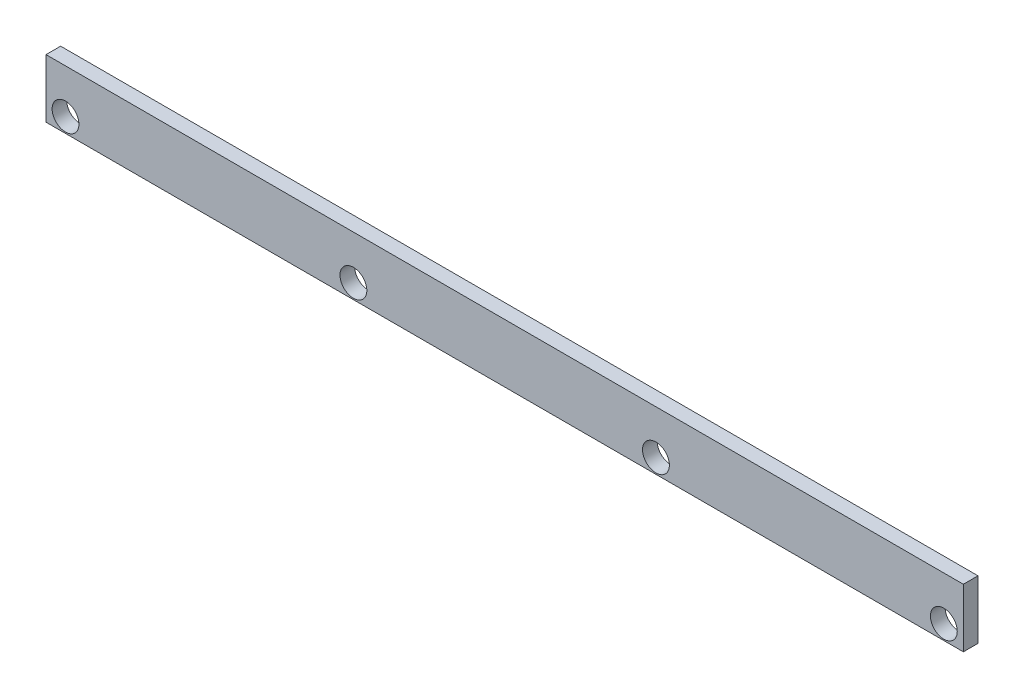
ISO-10303-21;
HEADER;
FILE_DESCRIPTION(('STEP AP214'),'2;1');
FILE_NAME('part.step','',(''),(''),'','','');
FILE_SCHEMA(('AUTOMOTIVE_DESIGN { 1 0 10303 214 1 1 1 1 }'));
ENDSEC;
DATA;
#1=APPLICATION_CONTEXT('core data for automotive mechanical design processes');
#2=APPLICATION_PROTOCOL_DEFINITION('international standard','automotive_design',2000,#1);
#3=PRODUCT_CONTEXT('',#1,'mechanical');
#4=PRODUCT('Part','Part','',(#3));
#5=PRODUCT_RELATED_PRODUCT_CATEGORY('part','',(#4));
#6=PRODUCT_DEFINITION_FORMATION('','',#4);
#7=PRODUCT_DEFINITION_CONTEXT('part definition',#1,'design');
#8=PRODUCT_DEFINITION('design','',#6,#7);
#9=PRODUCT_DEFINITION_SHAPE('','',#8);
#10=(LENGTH_UNIT() NAMED_UNIT(*) SI_UNIT(.MILLI.,.METRE.));
#11=(NAMED_UNIT(*) PLANE_ANGLE_UNIT() SI_UNIT($,.RADIAN.));
#12=(NAMED_UNIT(*) SI_UNIT($,.STERADIAN.) SOLID_ANGLE_UNIT());
#13=UNCERTAINTY_MEASURE_WITH_UNIT(LENGTH_MEASURE(1.E-05),#10,'distance_accuracy_value','');
#14=(GEOMETRIC_REPRESENTATION_CONTEXT(3) GLOBAL_UNCERTAINTY_ASSIGNED_CONTEXT((#13)) GLOBAL_UNIT_ASSIGNED_CONTEXT((#10,
#11,#12)) REPRESENTATION_CONTEXT('',''));
#15=CARTESIAN_POINT('',(0.,0.,0.));
#16=DIRECTION('',(0.,0.,1.));
#17=DIRECTION('',(1.,0.,0.));
#18=AXIS2_PLACEMENT_3D('',#15,#16,#17);
#19=CARTESIAN_POINT('',(0.,0.,3.));
#20=DIRECTION('',(0.,0.,1.));
#21=DIRECTION('',(1.,0.,0.));
#22=AXIS2_PLACEMENT_3D('',#19,#20,#21);
#23=PLANE('',#22);
#24=CARTESIAN_POINT('',(31.,-9.,3.));
#25=DIRECTION('',(0.,0.,1.));
#26=DIRECTION('',(1.,0.,0.));
#27=AXIS2_PLACEMENT_3D('',#24,#25,#26);
#28=CIRCLE('',#27,2.75);
#29=CARTESIAN_POINT('',(33.75,-9.,3.));
#30=VERTEX_POINT('',#29);
#31=EDGE_CURVE('E150',#30,#30,#28,.T.);
#32=ORIENTED_EDGE('',*,*,#31,.F.);
#33=EDGE_LOOP('',(#32));
#34=FACE_BOUND('',#33,.T.);
#35=CARTESIAN_POINT('',(-90.,-9.,3.));
#36=DIRECTION('',(0.,0.,1.));
#37=DIRECTION('',(1.,0.,0.));
#38=AXIS2_PLACEMENT_3D('',#35,#36,#37);
#39=CIRCLE('',#38,2.75);
#40=CARTESIAN_POINT('',(-87.25,-9.,3.));
#41=VERTEX_POINT('',#40);
#42=EDGE_CURVE('E120',#41,#41,#39,.T.);
#43=ORIENTED_EDGE('',*,*,#42,.F.);
#44=EDGE_LOOP('',(#43));
#45=FACE_BOUND('',#44,.T.);
#46=DIRECTION('',(0.,-1.,0.));
#47=VECTOR('',#46,1.);
#48=CARTESIAN_POINT('',(-94.,0.,3.));
#49=LINE('',#48,#47);
#50=CARTESIAN_POINT('',(-94.,0.,3.));
#51=VERTEX_POINT('',#50);
#52=CARTESIAN_POINT('',(-94.,-12.,3.));
#53=VERTEX_POINT('',#52);
#54=EDGE_CURVE('E98',#51,#53,#49,.T.);
#55=ORIENTED_EDGE('',*,*,#54,.T.);
#56=DIRECTION('',(1.,0.,0.));
#57=VECTOR('',#56,1.);
#58=CARTESIAN_POINT('',(-94.,-12.,3.));
#59=LINE('',#58,#57);
#60=CARTESIAN_POINT('',(94.,-12.,3.));
#61=VERTEX_POINT('',#60);
#62=EDGE_CURVE('E93',#53,#61,#59,.T.);
#63=ORIENTED_EDGE('',*,*,#62,.T.);
#64=DIRECTION('',(0.,1.,0.));
#65=VECTOR('',#64,1.);
#66=CARTESIAN_POINT('',(94.,-12.,3.));
#67=LINE('',#66,#65);
#68=CARTESIAN_POINT('',(94.,0.,3.));
#69=VERTEX_POINT('',#68);
#70=EDGE_CURVE('E96',#61,#69,#67,.T.);
#71=ORIENTED_EDGE('',*,*,#70,.T.);
#72=DIRECTION('',(-1.,0.,0.));
#73=VECTOR('',#72,1.);
#74=CARTESIAN_POINT('',(94.,0.,3.));
#75=LINE('',#74,#73);
#76=EDGE_CURVE('E63',#69,#51,#75,.T.);
#77=ORIENTED_EDGE('',*,*,#76,.T.);
#78=EDGE_LOOP('',(#55,#63,#71,#77));
#79=FACE_BOUND('',#78,.T.);
#80=CARTESIAN_POINT('',(-31.,-9.,3.));
#81=DIRECTION('',(0.,0.,1.));
#82=DIRECTION('',(1.,0.,0.));
#83=AXIS2_PLACEMENT_3D('',#80,#81,#82);
#84=CIRCLE('',#83,2.75);
#85=CARTESIAN_POINT('',(-28.25,-9.,3.));
#86=VERTEX_POINT('',#85);
#87=EDGE_CURVE('E143',#86,#86,#84,.T.);
#88=ORIENTED_EDGE('',*,*,#87,.F.);
#89=EDGE_LOOP('',(#88));
#90=FACE_BOUND('',#89,.T.);
#91=CARTESIAN_POINT('',(90.,-9.,3.));
#92=DIRECTION('',(0.,0.,1.));
#93=DIRECTION('',(1.,0.,0.));
#94=AXIS2_PLACEMENT_3D('',#91,#92,#93);
#95=CIRCLE('',#94,2.75);
#96=CARTESIAN_POINT('',(92.75,-9.,3.));
#97=VERTEX_POINT('',#96);
#98=EDGE_CURVE('E158',#97,#97,#95,.T.);
#99=ORIENTED_EDGE('',*,*,#98,.F.);
#100=EDGE_LOOP('',(#99));
#101=FACE_BOUND('',#100,.T.);
#102=ADVANCED_FACE('F45',(#34,#45,#79,#90,#101),#23,.T.);
#103=CARTESIAN_POINT('',(0.,0.,0.));
#104=DIRECTION('',(0.,0.,1.));
#105=DIRECTION('',(1.,0.,0.));
#106=AXIS2_PLACEMENT_3D('',#103,#104,#105);
#107=PLANE('',#106);
#108=DIRECTION('',(0.,-1.,0.));
#109=VECTOR('',#108,1.);
#110=CARTESIAN_POINT('',(-94.,0.,0.));
#111=LINE('',#110,#109);
#112=CARTESIAN_POINT('',(-94.,0.,0.));
#113=VERTEX_POINT('',#112);
#114=CARTESIAN_POINT('',(-94.,-12.,0.));
#115=VERTEX_POINT('',#114);
#116=EDGE_CURVE('E116',#113,#115,#111,.T.);
#117=ORIENTED_EDGE('',*,*,#116,.F.);
#118=DIRECTION('',(-1.,0.,0.));
#119=VECTOR('',#118,1.);
#120=CARTESIAN_POINT('',(94.,0.,0.));
#121=LINE('',#120,#119);
#122=CARTESIAN_POINT('',(94.,0.,0.));
#123=VERTEX_POINT('',#122);
#124=EDGE_CURVE('E86',#123,#113,#121,.T.);
#125=ORIENTED_EDGE('',*,*,#124,.F.);
#126=DIRECTION('',(0.,1.,0.));
#127=VECTOR('',#126,1.);
#128=CARTESIAN_POINT('',(94.,-12.,0.));
#129=LINE('',#128,#127);
#130=CARTESIAN_POINT('',(94.,-12.,0.));
#131=VERTEX_POINT('',#130);
#132=EDGE_CURVE('E80',#131,#123,#129,.T.);
#133=ORIENTED_EDGE('',*,*,#132,.F.);
#134=DIRECTION('',(1.,0.,0.));
#135=VECTOR('',#134,1.);
#136=CARTESIAN_POINT('',(-94.,-12.,0.));
#137=LINE('',#136,#135);
#138=EDGE_CURVE('E103',#115,#131,#137,.T.);
#139=ORIENTED_EDGE('',*,*,#138,.F.);
#140=EDGE_LOOP('',(#117,#125,#133,#139));
#141=FACE_BOUND('',#140,.T.);
#142=CARTESIAN_POINT('',(-90.,-9.,0.));
#143=DIRECTION('',(0.,0.,1.));
#144=DIRECTION('',(1.,0.,0.));
#145=AXIS2_PLACEMENT_3D('',#142,#143,#144);
#146=CIRCLE('',#145,2.75);
#147=CARTESIAN_POINT('',(-87.25,-9.,0.));
#148=VERTEX_POINT('',#147);
#149=EDGE_CURVE('E139',#148,#148,#146,.T.);
#150=ORIENTED_EDGE('',*,*,#149,.T.);
#151=EDGE_LOOP('',(#150));
#152=FACE_BOUND('',#151,.T.);
#153=CARTESIAN_POINT('',(-31.,-9.,0.));
#154=DIRECTION('',(0.,0.,1.));
#155=DIRECTION('',(1.,0.,0.));
#156=AXIS2_PLACEMENT_3D('',#153,#154,#155);
#157=CIRCLE('',#156,2.75);
#158=CARTESIAN_POINT('',(-28.25,-9.,0.));
#159=VERTEX_POINT('',#158);
#160=EDGE_CURVE('E146',#159,#159,#157,.T.);
#161=ORIENTED_EDGE('',*,*,#160,.T.);
#162=EDGE_LOOP('',(#161));
#163=FACE_BOUND('',#162,.T.);
#164=CARTESIAN_POINT('',(31.,-9.,0.));
#165=DIRECTION('',(0.,0.,1.));
#166=DIRECTION('',(1.,0.,0.));
#167=AXIS2_PLACEMENT_3D('',#164,#165,#166);
#168=CIRCLE('',#167,2.75);
#169=CARTESIAN_POINT('',(33.75,-9.,0.));
#170=VERTEX_POINT('',#169);
#171=EDGE_CURVE('E154',#170,#170,#168,.T.);
#172=ORIENTED_EDGE('',*,*,#171,.T.);
#173=EDGE_LOOP('',(#172));
#174=FACE_BOUND('',#173,.T.);
#175=CARTESIAN_POINT('',(90.,-9.,0.));
#176=DIRECTION('',(0.,0.,1.));
#177=DIRECTION('',(1.,0.,0.));
#178=AXIS2_PLACEMENT_3D('',#175,#176,#177);
#179=CIRCLE('',#178,2.75);
#180=CARTESIAN_POINT('',(92.75,-9.,0.));
#181=VERTEX_POINT('',#180);
#182=EDGE_CURVE('E162',#181,#181,#179,.T.);
#183=ORIENTED_EDGE('',*,*,#182,.T.);
#184=EDGE_LOOP('',(#183));
#185=FACE_BOUND('',#184,.T.);
#186=ADVANCED_FACE('F134',(#141,#152,#163,#174,#185),#107,.F.);
#187=CARTESIAN_POINT('',(-94.,0.,3.));
#188=DIRECTION('',(1.,0.,0.));
#189=DIRECTION('',(0.,0.,-1.));
#190=AXIS2_PLACEMENT_3D('',#187,#188,#189);
#191=PLANE('',#190);
#192=ORIENTED_EDGE('',*,*,#116,.T.);
#193=DIRECTION('',(0.,0.,-1.));
#194=VECTOR('',#193,1.);
#195=CARTESIAN_POINT('',(-94.,-12.,3.));
#196=LINE('',#195,#194);
#197=EDGE_CURVE('E11',#53,#115,#196,.T.);
#198=ORIENTED_EDGE('',*,*,#197,.F.);
#199=ORIENTED_EDGE('',*,*,#54,.F.);
#200=DIRECTION('',(0.,0.,-1.));
#201=VECTOR('',#200,1.);
#202=CARTESIAN_POINT('',(-94.,0.,3.));
#203=LINE('',#202,#201);
#204=EDGE_CURVE('E112',#51,#113,#203,.T.);
#205=ORIENTED_EDGE('',*,*,#204,.T.);
#206=EDGE_LOOP('',(#192,#198,#199,#205));
#207=FACE_BOUND('',#206,.T.);
#208=ADVANCED_FACE('F47',(#207),#191,.F.);
#209=CARTESIAN_POINT('',(-94.,-12.,3.));
#210=DIRECTION('',(0.,1.,0.));
#211=DIRECTION('',(0.,0.,1.));
#212=AXIS2_PLACEMENT_3D('',#209,#210,#211);
#213=PLANE('',#212);
#214=ORIENTED_EDGE('',*,*,#138,.T.);
#215=DIRECTION('',(0.,0.,-1.));
#216=VECTOR('',#215,1.);
#217=CARTESIAN_POINT('',(94.,-12.,3.));
#218=LINE('',#217,#216);
#219=EDGE_CURVE('E55',#61,#131,#218,.T.);
#220=ORIENTED_EDGE('',*,*,#219,.F.);
#221=ORIENTED_EDGE('',*,*,#62,.F.);
#222=ORIENTED_EDGE('',*,*,#197,.T.);
#223=EDGE_LOOP('',(#214,#220,#221,#222));
#224=FACE_BOUND('',#223,.T.);
#225=ADVANCED_FACE('F102',(#224),#213,.F.);
#226=CARTESIAN_POINT('',(94.,-12.,3.));
#227=DIRECTION('',(-1.,0.,0.));
#228=DIRECTION('',(0.,0.,1.));
#229=AXIS2_PLACEMENT_3D('',#226,#227,#228);
#230=PLANE('',#229);
#231=ORIENTED_EDGE('',*,*,#132,.T.);
#232=DIRECTION('',(0.,0.,-1.));
#233=VECTOR('',#232,1.);
#234=CARTESIAN_POINT('',(94.,0.,3.));
#235=LINE('',#234,#233);
#236=EDGE_CURVE('E105',#69,#123,#235,.T.);
#237=ORIENTED_EDGE('',*,*,#236,.F.);
#238=ORIENTED_EDGE('',*,*,#70,.F.);
#239=ORIENTED_EDGE('',*,*,#219,.T.);
#240=EDGE_LOOP('',(#231,#237,#238,#239));
#241=FACE_BOUND('',#240,.T.);
#242=ADVANCED_FACE('F106',(#241),#230,.F.);
#243=CARTESIAN_POINT('',(94.,0.,3.));
#244=DIRECTION('',(0.,-1.,0.));
#245=DIRECTION('',(0.,0.,-1.));
#246=AXIS2_PLACEMENT_3D('',#243,#244,#245);
#247=PLANE('',#246);
#248=ORIENTED_EDGE('',*,*,#124,.T.);
#249=ORIENTED_EDGE('',*,*,#204,.F.);
#250=ORIENTED_EDGE('',*,*,#76,.F.);
#251=ORIENTED_EDGE('',*,*,#236,.T.);
#252=EDGE_LOOP('',(#248,#249,#250,#251));
#253=FACE_BOUND('',#252,.T.);
#254=ADVANCED_FACE('F131',(#253),#247,.F.);
#255=CARTESIAN_POINT('',(-90.,-9.,3.));
#256=DIRECTION('',(0.,0.,-1.));
#257=DIRECTION('',(-1.,0.,0.));
#258=AXIS2_PLACEMENT_3D('',#255,#256,#257);
#259=CYLINDRICAL_SURFACE('',#258,2.75);
#260=ORIENTED_EDGE('',*,*,#42,.T.);
#261=EDGE_LOOP('',(#260));
#262=FACE_BOUND('',#261,.T.);
#263=ORIENTED_EDGE('',*,*,#149,.F.);
#264=EDGE_LOOP('',(#263));
#265=FACE_BOUND('',#264,.T.);
#266=ADVANCED_FACE('F180',(#262,#265),#259,.F.);
#267=CARTESIAN_POINT('',(-31.,-9.,3.));
#268=DIRECTION('',(0.,0.,-1.));
#269=DIRECTION('',(-1.,0.,0.));
#270=AXIS2_PLACEMENT_3D('',#267,#268,#269);
#271=CYLINDRICAL_SURFACE('',#270,2.75);
#272=ORIENTED_EDGE('',*,*,#87,.T.);
#273=EDGE_LOOP('',(#272));
#274=FACE_BOUND('',#273,.T.);
#275=ORIENTED_EDGE('',*,*,#160,.F.);
#276=EDGE_LOOP('',(#275));
#277=FACE_BOUND('',#276,.T.);
#278=ADVANCED_FACE('F231',(#274,#277),#271,.F.);
#279=CARTESIAN_POINT('',(31.,-9.,3.));
#280=DIRECTION('',(0.,0.,-1.));
#281=DIRECTION('',(-1.,0.,0.));
#282=AXIS2_PLACEMENT_3D('',#279,#280,#281);
#283=CYLINDRICAL_SURFACE('',#282,2.75);
#284=ORIENTED_EDGE('',*,*,#31,.T.);
#285=EDGE_LOOP('',(#284));
#286=FACE_BOUND('',#285,.T.);
#287=ORIENTED_EDGE('',*,*,#171,.F.);
#288=EDGE_LOOP('',(#287));
#289=FACE_BOUND('',#288,.T.);
#290=ADVANCED_FACE('F240',(#286,#289),#283,.F.);
#291=CARTESIAN_POINT('',(90.,-9.,3.));
#292=DIRECTION('',(0.,0.,-1.));
#293=DIRECTION('',(-1.,0.,0.));
#294=AXIS2_PLACEMENT_3D('',#291,#292,#293);
#295=CYLINDRICAL_SURFACE('',#294,2.75);
#296=ORIENTED_EDGE('',*,*,#98,.T.);
#297=EDGE_LOOP('',(#296));
#298=FACE_BOUND('',#297,.T.);
#299=ORIENTED_EDGE('',*,*,#182,.F.);
#300=EDGE_LOOP('',(#299));
#301=FACE_BOUND('',#300,.T.);
#302=ADVANCED_FACE('F168',(#298,#301),#295,.F.);
#303=CLOSED_SHELL('',(#102,#186,#208,#225,#242,#254,#266,#278,#290,#302));
#304=MANIFOLD_SOLID_BREP('B2',#303);
#305=ADVANCED_BREP_SHAPE_REPRESENTATION('',(#18,#304),#14);
#306=SHAPE_DEFINITION_REPRESENTATION(#9,#305);
ENDSEC;
END-ISO-10303-21;
